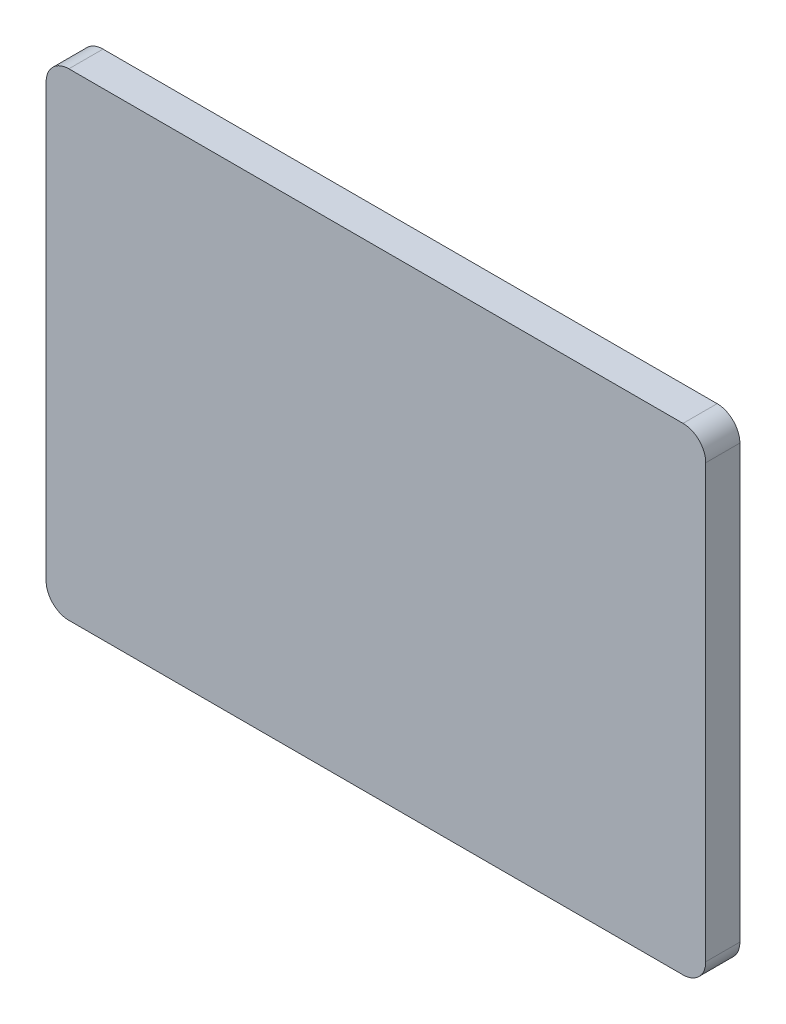
ISO-10303-21;
HEADER;
FILE_DESCRIPTION(('STEP AP214'),'2;1');
FILE_NAME('part.step','',(''),(''),'','','');
FILE_SCHEMA(('AUTOMOTIVE_DESIGN { 1 0 10303 214 1 1 1 1 }'));
ENDSEC;
DATA;
#1=APPLICATION_CONTEXT('core data for automotive mechanical design processes');
#2=APPLICATION_PROTOCOL_DEFINITION('international standard','automotive_design',2000,#1);
#3=PRODUCT_CONTEXT('',#1,'mechanical');
#4=PRODUCT('Part','Part','',(#3));
#5=PRODUCT_RELATED_PRODUCT_CATEGORY('part','',(#4));
#6=PRODUCT_DEFINITION_FORMATION('','',#4);
#7=PRODUCT_DEFINITION_CONTEXT('part definition',#1,'design');
#8=PRODUCT_DEFINITION('design','',#6,#7);
#9=PRODUCT_DEFINITION_SHAPE('','',#8);
#10=(LENGTH_UNIT() NAMED_UNIT(*) SI_UNIT(.MILLI.,.METRE.));
#11=(NAMED_UNIT(*) PLANE_ANGLE_UNIT() SI_UNIT($,.RADIAN.));
#12=(NAMED_UNIT(*) SI_UNIT($,.STERADIAN.) SOLID_ANGLE_UNIT());
#13=UNCERTAINTY_MEASURE_WITH_UNIT(LENGTH_MEASURE(1.E-05),#10,'distance_accuracy_value','');
#14=(GEOMETRIC_REPRESENTATION_CONTEXT(3) GLOBAL_UNCERTAINTY_ASSIGNED_CONTEXT((#13)) GLOBAL_UNIT_ASSIGNED_CONTEXT((#10,
#11,#12)) REPRESENTATION_CONTEXT('',''));
#15=CARTESIAN_POINT('',(0.,0.,0.));
#16=DIRECTION('',(0.,0.,1.));
#17=DIRECTION('',(1.,0.,0.));
#18=AXIS2_PLACEMENT_3D('',#15,#16,#17);
#19=CARTESIAN_POINT('',(-1.45,-1.05,0.75));
#20=DIRECTION('',(0.,0.,1.));
#21=DIRECTION('',(1.,0.,0.));
#22=AXIS2_PLACEMENT_3D('',#19,#20,#21);
#23=PLANE('',#22);
#24=CARTESIAN_POINT('',(-1.35,0.95,0.75));
#25=DIRECTION('',(0.,0.,1.));
#26=DIRECTION('',(1.,0.,0.));
#27=AXIS2_PLACEMENT_3D('',#24,#25,#26);
#28=CIRCLE('',#27,0.1);
#29=CARTESIAN_POINT('',(-1.45,0.95,0.75));
#30=VERTEX_POINT('',#29);
#31=CARTESIAN_POINT('',(-1.35,1.05,0.75));
#32=VERTEX_POINT('',#31);
#33=EDGE_CURVE('E95',#30,#32,#28,.F.);
#34=ORIENTED_EDGE('',*,*,#33,.F.);
#35=DIRECTION('',(0.,1.,0.));
#36=VECTOR('',#35,1.);
#37=CARTESIAN_POINT('',(-1.45,-0.95,0.75));
#38=LINE('',#37,#36);
#39=CARTESIAN_POINT('',(-1.45,-0.95,0.75));
#40=VERTEX_POINT('',#39);
#41=EDGE_CURVE('E105',#40,#30,#38,.T.);
#42=ORIENTED_EDGE('',*,*,#41,.F.);
#43=CARTESIAN_POINT('',(-1.35,-0.95,0.75));
#44=DIRECTION('',(0.,0.,-1.));
#45=DIRECTION('',(-1.,0.,0.));
#46=AXIS2_PLACEMENT_3D('',#43,#44,#45);
#47=CIRCLE('',#46,0.1);
#48=CARTESIAN_POINT('',(-1.35,-1.05,0.75));
#49=VERTEX_POINT('',#48);
#50=EDGE_CURVE('E126',#49,#40,#47,.T.);
#51=ORIENTED_EDGE('',*,*,#50,.F.);
#52=DIRECTION('',(1.,0.,0.));
#53=VECTOR('',#52,1.);
#54=CARTESIAN_POINT('',(1.35,-1.05,0.75));
#55=LINE('',#54,#53);
#56=CARTESIAN_POINT('',(1.35,-1.05,0.75));
#57=VERTEX_POINT('',#56);
#58=EDGE_CURVE('E109',#57,#49,#55,.F.);
#59=ORIENTED_EDGE('',*,*,#58,.F.);
#60=CARTESIAN_POINT('',(1.35,-0.95,0.75));
#61=DIRECTION('',(0.,0.,1.));
#62=DIRECTION('',(1.,0.,0.));
#63=AXIS2_PLACEMENT_3D('',#60,#61,#62);
#64=CIRCLE('',#63,0.1);
#65=CARTESIAN_POINT('',(1.45,-0.95,0.75));
#66=VERTEX_POINT('',#65);
#67=EDGE_CURVE('E127',#66,#57,#64,.F.);
#68=ORIENTED_EDGE('',*,*,#67,.F.);
#69=DIRECTION('',(0.,1.,0.));
#70=VECTOR('',#69,1.);
#71=CARTESIAN_POINT('',(1.45,0.95,0.75));
#72=LINE('',#71,#70);
#73=CARTESIAN_POINT('',(1.45,0.95,0.75));
#74=VERTEX_POINT('',#73);
#75=EDGE_CURVE('E85',#74,#66,#72,.F.);
#76=ORIENTED_EDGE('',*,*,#75,.F.);
#77=CARTESIAN_POINT('',(1.35,0.95,0.75));
#78=DIRECTION('',(0.,0.,1.));
#79=DIRECTION('',(1.,0.,0.));
#80=AXIS2_PLACEMENT_3D('',#77,#78,#79);
#81=CIRCLE('',#80,0.1);
#82=CARTESIAN_POINT('',(1.35,1.05,0.75));
#83=VERTEX_POINT('',#82);
#84=EDGE_CURVE('E20',#83,#74,#81,.F.);
#85=ORIENTED_EDGE('',*,*,#84,.F.);
#86=DIRECTION('',(1.,0.,0.));
#87=VECTOR('',#86,1.);
#88=CARTESIAN_POINT('',(-1.35,1.05,0.75));
#89=LINE('',#88,#87);
#90=EDGE_CURVE('E83',#32,#83,#89,.T.);
#91=ORIENTED_EDGE('',*,*,#90,.F.);
#92=EDGE_LOOP('',(#34,#42,#51,#59,#68,#76,#85,#91));
#93=FACE_BOUND('',#92,.T.);
#94=ADVANCED_FACE('F17',(#93),#23,.T.);
#95=CARTESIAN_POINT('',(1.35,0.95,0.6));
#96=DIRECTION('',(0.,0.,1.));
#97=DIRECTION('',(1.,0.,0.));
#98=AXIS2_PLACEMENT_3D('',#95,#96,#97);
#99=CYLINDRICAL_SURFACE('',#98,0.1);
#100=DIRECTION('',(0.,0.,1.));
#101=VECTOR('',#100,1.);
#102=CARTESIAN_POINT('',(1.35,1.05,0.6));
#103=LINE('',#102,#101);
#104=CARTESIAN_POINT('',(1.35,1.05,0.6));
#105=VERTEX_POINT('',#104);
#106=EDGE_CURVE('E90',#83,#105,#103,.F.);
#107=ORIENTED_EDGE('',*,*,#106,.F.);
#108=ORIENTED_EDGE('',*,*,#84,.T.);
#109=DIRECTION('',(0.,0.,-1.));
#110=VECTOR('',#109,1.);
#111=CARTESIAN_POINT('',(1.45,0.95,0.6));
#112=LINE('',#111,#110);
#113=CARTESIAN_POINT('',(1.45,0.95,0.6));
#114=VERTEX_POINT('',#113);
#115=EDGE_CURVE('E88',#114,#74,#112,.F.);
#116=ORIENTED_EDGE('',*,*,#115,.F.);
#117=CARTESIAN_POINT('',(1.35,0.95,0.6));
#118=DIRECTION('',(0.,0.,1.));
#119=DIRECTION('',(1.,0.,0.));
#120=AXIS2_PLACEMENT_3D('',#117,#118,#119);
#121=CIRCLE('',#120,0.1);
#122=EDGE_CURVE('E93',#105,#114,#121,.F.);
#123=ORIENTED_EDGE('',*,*,#122,.F.);
#124=EDGE_LOOP('',(#107,#108,#116,#123));
#125=FACE_BOUND('',#124,.T.);
#126=ADVANCED_FACE('F91',(#125),#99,.T.);
#127=CARTESIAN_POINT('',(1.45,0.95,0.6));
#128=DIRECTION('',(1.,0.,0.));
#129=DIRECTION('',(0.,0.,-1.));
#130=AXIS2_PLACEMENT_3D('',#127,#128,#129);
#131=PLANE('',#130);
#132=ORIENTED_EDGE('',*,*,#115,.T.);
#133=ORIENTED_EDGE('',*,*,#75,.T.);
#134=DIRECTION('',(0.,0.,1.));
#135=VECTOR('',#134,1.);
#136=CARTESIAN_POINT('',(1.45,-0.95,0.6));
#137=LINE('',#136,#135);
#138=CARTESIAN_POINT('',(1.45,-0.95,0.6));
#139=VERTEX_POINT('',#138);
#140=EDGE_CURVE('E114',#139,#66,#137,.T.);
#141=ORIENTED_EDGE('',*,*,#140,.F.);
#142=DIRECTION('',(0.,1.,0.));
#143=VECTOR('',#142,1.);
#144=CARTESIAN_POINT('',(1.45,-1.05,0.6));
#145=LINE('',#144,#143);
#146=EDGE_CURVE('E99',#114,#139,#145,.F.);
#147=ORIENTED_EDGE('',*,*,#146,.F.);
#148=EDGE_LOOP('',(#132,#133,#141,#147));
#149=FACE_BOUND('',#148,.T.);
#150=ADVANCED_FACE('F215',(#149),#131,.T.);
#151=CARTESIAN_POINT('',(1.35,-0.95,0.6));
#152=DIRECTION('',(0.,0.,1.));
#153=DIRECTION('',(1.,0.,0.));
#154=AXIS2_PLACEMENT_3D('',#151,#152,#153);
#155=CYLINDRICAL_SURFACE('',#154,0.1);
#156=ORIENTED_EDGE('',*,*,#140,.T.);
#157=ORIENTED_EDGE('',*,*,#67,.T.);
#158=DIRECTION('',(0.,0.,-1.));
#159=VECTOR('',#158,1.);
#160=CARTESIAN_POINT('',(1.35,-1.05,0.6));
#161=LINE('',#160,#159);
#162=CARTESIAN_POINT('',(1.35,-1.05,0.6));
#163=VERTEX_POINT('',#162);
#164=EDGE_CURVE('E112',#163,#57,#161,.F.);
#165=ORIENTED_EDGE('',*,*,#164,.F.);
#166=CARTESIAN_POINT('',(1.35,-0.95,0.6));
#167=DIRECTION('',(0.,0.,1.));
#168=DIRECTION('',(1.,0.,0.));
#169=AXIS2_PLACEMENT_3D('',#166,#167,#168);
#170=CIRCLE('',#169,0.1);
#171=EDGE_CURVE('E122',#139,#163,#170,.F.);
#172=ORIENTED_EDGE('',*,*,#171,.F.);
#173=EDGE_LOOP('',(#156,#157,#165,#172));
#174=FACE_BOUND('',#173,.T.);
#175=ADVANCED_FACE('F205',(#174),#155,.T.);
#176=CARTESIAN_POINT('',(1.35,-1.05,0.6));
#177=DIRECTION('',(0.,-1.,0.));
#178=DIRECTION('',(0.,0.,-1.));
#179=AXIS2_PLACEMENT_3D('',#176,#177,#178);
#180=PLANE('',#179);
#181=ORIENTED_EDGE('',*,*,#164,.T.);
#182=ORIENTED_EDGE('',*,*,#58,.T.);
#183=DIRECTION('',(0.,0.,-1.));
#184=VECTOR('',#183,1.);
#185=CARTESIAN_POINT('',(-1.35,-1.05,0.75));
#186=LINE('',#185,#184);
#187=CARTESIAN_POINT('',(-1.35,-1.05,0.6));
#188=VERTEX_POINT('',#187);
#189=EDGE_CURVE('E111',#188,#49,#186,.F.);
#190=ORIENTED_EDGE('',*,*,#189,.F.);
#191=DIRECTION('',(-1.,0.,0.));
#192=VECTOR('',#191,1.);
#193=CARTESIAN_POINT('',(-1.45,-1.05,0.6));
#194=LINE('',#193,#192);
#195=EDGE_CURVE('E121',#163,#188,#194,.T.);
#196=ORIENTED_EDGE('',*,*,#195,.F.);
#197=EDGE_LOOP('',(#181,#182,#190,#196));
#198=FACE_BOUND('',#197,.T.);
#199=ADVANCED_FACE('F195',(#198),#180,.T.);
#200=CARTESIAN_POINT('',(-1.35,-0.95,0.75));
#201=DIRECTION('',(0.,0.,-1.));
#202=DIRECTION('',(-1.,0.,0.));
#203=AXIS2_PLACEMENT_3D('',#200,#201,#202);
#204=CYLINDRICAL_SURFACE('',#203,0.1);
#205=DIRECTION('',(0.,0.,1.));
#206=VECTOR('',#205,1.);
#207=CARTESIAN_POINT('',(-1.45,-0.95,0.6));
#208=LINE('',#207,#206);
#209=CARTESIAN_POINT('',(-1.45,-0.95,0.6));
#210=VERTEX_POINT('',#209);
#211=EDGE_CURVE('E108',#210,#40,#208,.T.);
#212=ORIENTED_EDGE('',*,*,#211,.F.);
#213=CARTESIAN_POINT('',(-1.35,-0.95,0.6));
#214=DIRECTION('',(0.,0.,-1.));
#215=DIRECTION('',(-1.,0.,0.));
#216=AXIS2_PLACEMENT_3D('',#213,#214,#215);
#217=CIRCLE('',#216,0.1);
#218=EDGE_CURVE('E118',#188,#210,#217,.T.);
#219=ORIENTED_EDGE('',*,*,#218,.F.);
#220=ORIENTED_EDGE('',*,*,#189,.T.);
#221=ORIENTED_EDGE('',*,*,#50,.T.);
#222=EDGE_LOOP('',(#212,#219,#220,#221));
#223=FACE_BOUND('',#222,.T.);
#224=ADVANCED_FACE('F162',(#223),#204,.T.);
#225=CARTESIAN_POINT('',(-1.45,-0.95,0.6));
#226=DIRECTION('',(-1.,0.,0.));
#227=DIRECTION('',(0.,0.,1.));
#228=AXIS2_PLACEMENT_3D('',#225,#226,#227);
#229=PLANE('',#228);
#230=ORIENTED_EDGE('',*,*,#41,.T.);
#231=DIRECTION('',(0.,0.,1.));
#232=VECTOR('',#231,1.);
#233=CARTESIAN_POINT('',(-1.45,0.95,0.6));
#234=LINE('',#233,#232);
#235=CARTESIAN_POINT('',(-1.45,0.95,0.6));
#236=VERTEX_POINT('',#235);
#237=EDGE_CURVE('E107',#236,#30,#234,.T.);
#238=ORIENTED_EDGE('',*,*,#237,.F.);
#239=DIRECTION('',(0.,1.,0.));
#240=VECTOR('',#239,1.);
#241=CARTESIAN_POINT('',(-1.45,-1.05,0.6));
#242=LINE('',#241,#240);
#243=EDGE_CURVE('E117',#210,#236,#242,.T.);
#244=ORIENTED_EDGE('',*,*,#243,.F.);
#245=ORIENTED_EDGE('',*,*,#211,.T.);
#246=EDGE_LOOP('',(#230,#238,#244,#245));
#247=FACE_BOUND('',#246,.T.);
#248=ADVANCED_FACE('F151',(#247),#229,.T.);
#249=CARTESIAN_POINT('',(-1.35,0.95,0.6));
#250=DIRECTION('',(0.,0.,1.));
#251=DIRECTION('',(1.,0.,0.));
#252=AXIS2_PLACEMENT_3D('',#249,#250,#251);
#253=CYLINDRICAL_SURFACE('',#252,0.1);
#254=ORIENTED_EDGE('',*,*,#237,.T.);
#255=ORIENTED_EDGE('',*,*,#33,.T.);
#256=DIRECTION('',(0.,0.,1.));
#257=VECTOR('',#256,1.);
#258=CARTESIAN_POINT('',(-1.35,1.05,0.6));
#259=LINE('',#258,#257);
#260=CARTESIAN_POINT('',(-1.35,1.05,0.6));
#261=VERTEX_POINT('',#260);
#262=EDGE_CURVE('E35',#261,#32,#259,.T.);
#263=ORIENTED_EDGE('',*,*,#262,.F.);
#264=CARTESIAN_POINT('',(-1.35,0.95,0.6));
#265=DIRECTION('',(0.,0.,1.));
#266=DIRECTION('',(1.,0.,0.));
#267=AXIS2_PLACEMENT_3D('',#264,#265,#266);
#268=CIRCLE('',#267,0.1);
#269=EDGE_CURVE('E26',#236,#261,#268,.F.);
#270=ORIENTED_EDGE('',*,*,#269,.F.);
#271=EDGE_LOOP('',(#254,#255,#263,#270));
#272=FACE_BOUND('',#271,.T.);
#273=ADVANCED_FACE('F153',(#272),#253,.T.);
#274=CARTESIAN_POINT('',(-1.35,1.05,0.6));
#275=DIRECTION('',(0.,1.,0.));
#276=DIRECTION('',(0.,0.,1.));
#277=AXIS2_PLACEMENT_3D('',#274,#275,#276);
#278=PLANE('',#277);
#279=ORIENTED_EDGE('',*,*,#262,.T.);
#280=ORIENTED_EDGE('',*,*,#90,.T.);
#281=ORIENTED_EDGE('',*,*,#106,.T.);
#282=DIRECTION('',(-1.,0.,0.));
#283=VECTOR('',#282,1.);
#284=CARTESIAN_POINT('',(-1.45,1.05,0.6));
#285=LINE('',#284,#283);
#286=EDGE_CURVE('E11',#261,#105,#285,.F.);
#287=ORIENTED_EDGE('',*,*,#286,.F.);
#288=EDGE_LOOP('',(#279,#280,#281,#287));
#289=FACE_BOUND('',#288,.T.);
#290=ADVANCED_FACE('F97',(#289),#278,.T.);
#291=CARTESIAN_POINT('',(-1.45,-1.05,0.6));
#292=DIRECTION('',(0.,0.,-1.));
#293=DIRECTION('',(-1.,0.,0.));
#294=AXIS2_PLACEMENT_3D('',#291,#292,#293);
#295=PLANE('',#294);
#296=ORIENTED_EDGE('',*,*,#269,.T.);
#297=ORIENTED_EDGE('',*,*,#286,.T.);
#298=ORIENTED_EDGE('',*,*,#122,.T.);
#299=ORIENTED_EDGE('',*,*,#146,.T.);
#300=ORIENTED_EDGE('',*,*,#171,.T.);
#301=ORIENTED_EDGE('',*,*,#195,.T.);
#302=ORIENTED_EDGE('',*,*,#218,.T.);
#303=ORIENTED_EDGE('',*,*,#243,.T.);
#304=EDGE_LOOP('',(#296,#297,#298,#299,#300,#301,#302,#303));
#305=FACE_BOUND('',#304,.T.);
#306=ADVANCED_FACE('F148',(#305),#295,.T.);
#307=CLOSED_SHELL('',(#94,#126,#150,#175,#199,#224,#248,#273,#290,#306));
#308=MANIFOLD_SOLID_BREP('B1',#307);
#309=ADVANCED_BREP_SHAPE_REPRESENTATION('',(#18,#308),#14);
#310=SHAPE_DEFINITION_REPRESENTATION(#9,#309);
ENDSEC;
END-ISO-10303-21;
